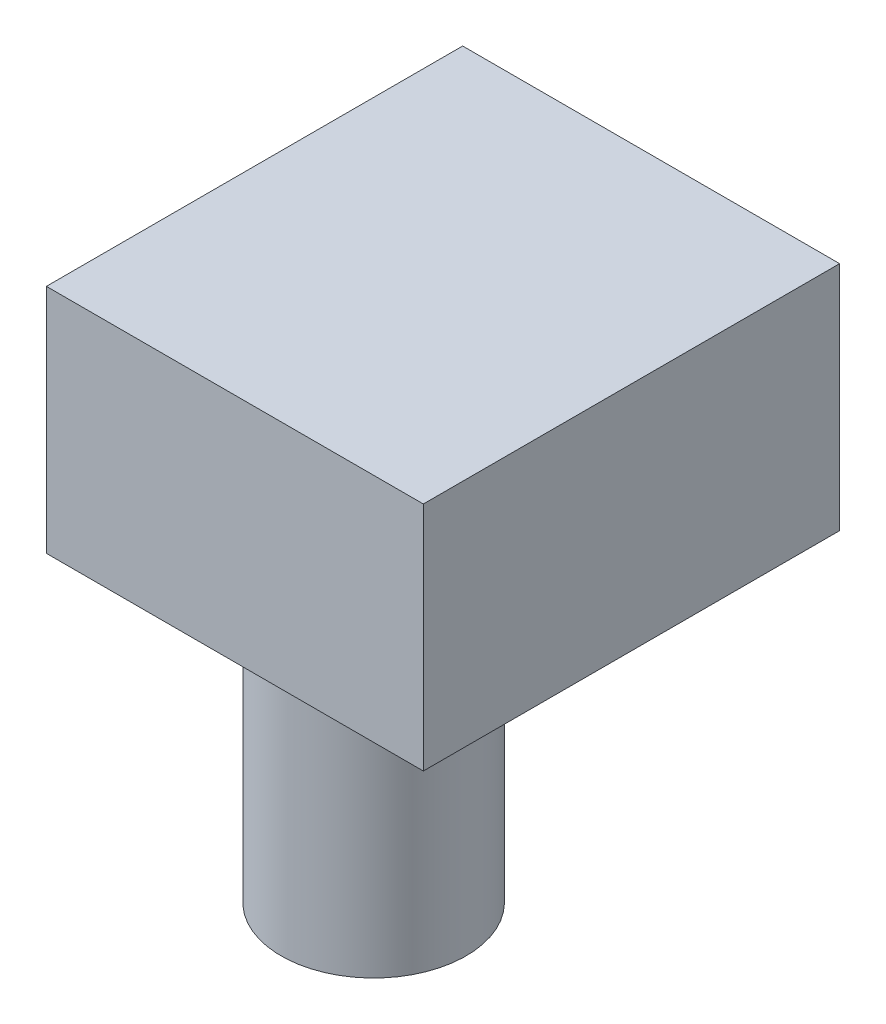
ISO-10303-21;
HEADER;
FILE_DESCRIPTION(('STEP AP214'),'2;1');
FILE_NAME('part.step','',(''),(''),'','','');
FILE_SCHEMA(('AUTOMOTIVE_DESIGN { 1 0 10303 214 1 1 1 1 }'));
ENDSEC;
DATA;
#1=APPLICATION_CONTEXT('core data for automotive mechanical design processes');
#2=APPLICATION_PROTOCOL_DEFINITION('international standard','automotive_design',2000,#1);
#3=PRODUCT_CONTEXT('',#1,'mechanical');
#4=PRODUCT('Part','Part','',(#3));
#5=PRODUCT_RELATED_PRODUCT_CATEGORY('part','',(#4));
#6=PRODUCT_DEFINITION_FORMATION('','',#4);
#7=PRODUCT_DEFINITION_CONTEXT('part definition',#1,'design');
#8=PRODUCT_DEFINITION('design','',#6,#7);
#9=PRODUCT_DEFINITION_SHAPE('','',#8);
#10=(LENGTH_UNIT() NAMED_UNIT(*) SI_UNIT(.MILLI.,.METRE.));
#11=(NAMED_UNIT(*) PLANE_ANGLE_UNIT() SI_UNIT($,.RADIAN.));
#12=(NAMED_UNIT(*) SI_UNIT($,.STERADIAN.) SOLID_ANGLE_UNIT());
#13=UNCERTAINTY_MEASURE_WITH_UNIT(LENGTH_MEASURE(1.E-05),#10,'distance_accuracy_value','');
#14=(GEOMETRIC_REPRESENTATION_CONTEXT(3) GLOBAL_UNCERTAINTY_ASSIGNED_CONTEXT((#13)) GLOBAL_UNIT_ASSIGNED_CONTEXT((#10,
#11,#12)) REPRESENTATION_CONTEXT('',''));
#15=CARTESIAN_POINT('',(0.,0.,0.));
#16=DIRECTION('',(0.,0.,1.));
#17=DIRECTION('',(1.,0.,0.));
#18=AXIS2_PLACEMENT_3D('',#15,#16,#17);
#19=CARTESIAN_POINT('',(0.,0.,0.));
#20=DIRECTION('',(0.,-1.,0.));
#21=DIRECTION('',(0.,0.,-1.));
#22=AXIS2_PLACEMENT_3D('',#19,#20,#21);
#23=PLANE('',#22);
#24=DIRECTION('',(0.,0.,1.));
#25=VECTOR('',#24,1.);
#26=CARTESIAN_POINT('',(0.,0.,0.));
#27=LINE('',#26,#25);
#28=CARTESIAN_POINT('',(0.,0.,-18.));
#29=VERTEX_POINT('',#28);
#30=CARTESIAN_POINT('',(0.,0.,0.));
#31=VERTEX_POINT('',#30);
#32=EDGE_CURVE('E99',#29,#31,#27,.T.);
#33=ORIENTED_EDGE('',*,*,#32,.F.);
#34=DIRECTION('',(-1.,0.,0.));
#35=VECTOR('',#34,1.);
#36=CARTESIAN_POINT('',(0.,0.,-18.));
#37=LINE('',#36,#35);
#38=CARTESIAN_POINT('',(16.3,0.,-18.));
#39=VERTEX_POINT('',#38);
#40=EDGE_CURVE('E75',#39,#29,#37,.T.);
#41=ORIENTED_EDGE('',*,*,#40,.F.);
#42=DIRECTION('',(0.,0.,-1.));
#43=VECTOR('',#42,1.);
#44=CARTESIAN_POINT('',(16.3,0.,0.));
#45=LINE('',#44,#43);
#46=CARTESIAN_POINT('',(16.3,0.,0.));
#47=VERTEX_POINT('',#46);
#48=EDGE_CURVE('E69',#47,#39,#45,.T.);
#49=ORIENTED_EDGE('',*,*,#48,.F.);
#50=DIRECTION('',(1.,0.,0.));
#51=VECTOR('',#50,1.);
#52=CARTESIAN_POINT('',(0.,0.,0.));
#53=LINE('',#52,#51);
#54=EDGE_CURVE('E91',#31,#47,#53,.T.);
#55=ORIENTED_EDGE('',*,*,#54,.F.);
#56=EDGE_LOOP('',(#33,#41,#49,#55));
#57=FACE_BOUND('',#56,.T.);
#58=CARTESIAN_POINT('',(8.14999999999999,0.,-6.));
#59=DIRECTION('',(0.,-1.,0.));
#60=DIRECTION('',(0.,0.,-1.));
#61=AXIS2_PLACEMENT_3D('',#58,#59,#60);
#62=CIRCLE('',#61,4.);
#63=CARTESIAN_POINT('',(8.14999999999999,0.,-10.));
#64=VERTEX_POINT('',#63);
#65=EDGE_CURVE('E113',#64,#64,#62,.T.);
#66=ORIENTED_EDGE('',*,*,#65,.F.);
#67=EDGE_LOOP('',(#66));
#68=FACE_BOUND('',#67,.T.);
#69=ADVANCED_FACE('F35',(#57,#68),#23,.T.);
#70=CARTESIAN_POINT('',(0.,10.,0.));
#71=DIRECTION('',(1.,0.,0.));
#72=DIRECTION('',(0.,0.,-1.));
#73=AXIS2_PLACEMENT_3D('',#70,#71,#72);
#74=PLANE('',#73);
#75=ORIENTED_EDGE('',*,*,#32,.T.);
#76=DIRECTION('',(0.,-1.,0.));
#77=VECTOR('',#76,1.);
#78=CARTESIAN_POINT('',(0.,10.,0.));
#79=LINE('',#78,#77);
#80=CARTESIAN_POINT('',(0.,10.,0.));
#81=VERTEX_POINT('',#80);
#82=EDGE_CURVE('E11',#81,#31,#79,.T.);
#83=ORIENTED_EDGE('',*,*,#82,.F.);
#84=DIRECTION('',(0.,0.,1.));
#85=VECTOR('',#84,1.);
#86=CARTESIAN_POINT('',(0.,10.,0.));
#87=LINE('',#86,#85);
#88=CARTESIAN_POINT('',(0.,10.,-18.));
#89=VERTEX_POINT('',#88);
#90=EDGE_CURVE('E87',#89,#81,#87,.T.);
#91=ORIENTED_EDGE('',*,*,#90,.F.);
#92=DIRECTION('',(0.,-1.,0.));
#93=VECTOR('',#92,1.);
#94=CARTESIAN_POINT('',(0.,10.,-18.));
#95=LINE('',#94,#93);
#96=EDGE_CURVE('E95',#89,#29,#95,.T.);
#97=ORIENTED_EDGE('',*,*,#96,.T.);
#98=EDGE_LOOP('',(#75,#83,#91,#97));
#99=FACE_BOUND('',#98,.T.);
#100=ADVANCED_FACE('F37',(#99),#74,.F.);
#101=CARTESIAN_POINT('',(0.,10.,0.));
#102=DIRECTION('',(0.,0.,-1.));
#103=DIRECTION('',(-1.,0.,0.));
#104=AXIS2_PLACEMENT_3D('',#101,#102,#103);
#105=PLANE('',#104);
#106=ORIENTED_EDGE('',*,*,#54,.T.);
#107=DIRECTION('',(0.,-1.,0.));
#108=VECTOR('',#107,1.);
#109=CARTESIAN_POINT('',(16.3,10.,0.));
#110=LINE('',#109,#108);
#111=CARTESIAN_POINT('',(16.3,10.,0.));
#112=VERTEX_POINT('',#111);
#113=EDGE_CURVE('E44',#112,#47,#110,.T.);
#114=ORIENTED_EDGE('',*,*,#113,.F.);
#115=DIRECTION('',(1.,0.,0.));
#116=VECTOR('',#115,1.);
#117=CARTESIAN_POINT('',(0.,10.,0.));
#118=LINE('',#117,#116);
#119=EDGE_CURVE('E82',#81,#112,#118,.T.);
#120=ORIENTED_EDGE('',*,*,#119,.F.);
#121=ORIENTED_EDGE('',*,*,#82,.T.);
#122=EDGE_LOOP('',(#106,#114,#120,#121));
#123=FACE_BOUND('',#122,.T.);
#124=ADVANCED_FACE('F90',(#123),#105,.F.);
#125=CARTESIAN_POINT('',(16.3,10.,0.));
#126=DIRECTION('',(-1.,0.,0.));
#127=DIRECTION('',(0.,0.,1.));
#128=AXIS2_PLACEMENT_3D('',#125,#126,#127);
#129=PLANE('',#128);
#130=ORIENTED_EDGE('',*,*,#48,.T.);
#131=DIRECTION('',(0.,-1.,0.));
#132=VECTOR('',#131,1.);
#133=CARTESIAN_POINT('',(16.3,10.,-18.));
#134=LINE('',#133,#132);
#135=CARTESIAN_POINT('',(16.3,10.,-18.));
#136=VERTEX_POINT('',#135);
#137=EDGE_CURVE('E92',#136,#39,#134,.T.);
#138=ORIENTED_EDGE('',*,*,#137,.F.);
#139=DIRECTION('',(0.,0.,-1.));
#140=VECTOR('',#139,1.);
#141=CARTESIAN_POINT('',(16.3,10.,0.));
#142=LINE('',#141,#140);
#143=EDGE_CURVE('E85',#112,#136,#142,.T.);
#144=ORIENTED_EDGE('',*,*,#143,.F.);
#145=ORIENTED_EDGE('',*,*,#113,.T.);
#146=EDGE_LOOP('',(#130,#138,#144,#145));
#147=FACE_BOUND('',#146,.T.);
#148=ADVANCED_FACE('F93',(#147),#129,.F.);
#149=CARTESIAN_POINT('',(0.,10.,-18.));
#150=DIRECTION('',(0.,0.,1.));
#151=DIRECTION('',(1.,0.,0.));
#152=AXIS2_PLACEMENT_3D('',#149,#150,#151);
#153=PLANE('',#152);
#154=ORIENTED_EDGE('',*,*,#40,.T.);
#155=ORIENTED_EDGE('',*,*,#96,.F.);
#156=DIRECTION('',(-1.,0.,0.));
#157=VECTOR('',#156,1.);
#158=CARTESIAN_POINT('',(0.,10.,-18.));
#159=LINE('',#158,#157);
#160=EDGE_CURVE('E52',#136,#89,#159,.T.);
#161=ORIENTED_EDGE('',*,*,#160,.F.);
#162=ORIENTED_EDGE('',*,*,#137,.T.);
#163=EDGE_LOOP('',(#154,#155,#161,#162));
#164=FACE_BOUND('',#163,.T.);
#165=ADVANCED_FACE('F107',(#164),#153,.F.);
#166=CARTESIAN_POINT('',(0.,10.,0.));
#167=DIRECTION('',(0.,-1.,0.));
#168=DIRECTION('',(0.,0.,-1.));
#169=AXIS2_PLACEMENT_3D('',#166,#167,#168);
#170=PLANE('',#169);
#171=ORIENTED_EDGE('',*,*,#90,.T.);
#172=ORIENTED_EDGE('',*,*,#119,.T.);
#173=ORIENTED_EDGE('',*,*,#143,.T.);
#174=ORIENTED_EDGE('',*,*,#160,.T.);
#175=EDGE_LOOP('',(#171,#172,#173,#174));
#176=FACE_BOUND('',#175,.T.);
#177=ADVANCED_FACE('F83',(#176),#170,.F.);
#178=CARTESIAN_POINT('',(8.14999999999999,-12.,-6.));
#179=DIRECTION('',(0.,1.,0.));
#180=DIRECTION('',(0.,0.,1.));
#181=AXIS2_PLACEMENT_3D('',#178,#179,#180);
#182=CYLINDRICAL_SURFACE('',#181,4.);
#183=CARTESIAN_POINT('',(8.14999999999999,-12.,-6.));
#184=DIRECTION('',(0.,-1.,0.));
#185=DIRECTION('',(0.,0.,-1.));
#186=AXIS2_PLACEMENT_3D('',#183,#184,#185);
#187=CIRCLE('',#186,4.);
#188=CARTESIAN_POINT('',(8.14999999999999,-12.,-10.));
#189=VERTEX_POINT('',#188);
#190=EDGE_CURVE('E102',#189,#189,#187,.T.);
#191=ORIENTED_EDGE('',*,*,#190,.F.);
#192=EDGE_LOOP('',(#191));
#193=FACE_BOUND('',#192,.T.);
#194=ORIENTED_EDGE('',*,*,#65,.T.);
#195=EDGE_LOOP('',(#194));
#196=FACE_BOUND('',#195,.T.);
#197=ADVANCED_FACE('F121',(#193,#196),#182,.T.);
#198=CARTESIAN_POINT('',(8.14999999999999,-12.,-6.));
#199=DIRECTION('',(0.,-1.,0.));
#200=DIRECTION('',(0.,0.,-1.));
#201=AXIS2_PLACEMENT_3D('',#198,#199,#200);
#202=PLANE('',#201);
#203=ORIENTED_EDGE('',*,*,#190,.T.);
#204=EDGE_LOOP('',(#203));
#205=FACE_BOUND('',#204,.T.);
#206=ADVANCED_FACE('F119',(#205),#202,.T.);
#207=CLOSED_SHELL('',(#69,#100,#124,#148,#165,#177,#197,#206));
#208=MANIFOLD_SOLID_BREP('B2',#207);
#209=ADVANCED_BREP_SHAPE_REPRESENTATION('',(#18,#208),#14);
#210=SHAPE_DEFINITION_REPRESENTATION(#9,#209);
ENDSEC;
END-ISO-10303-21;
